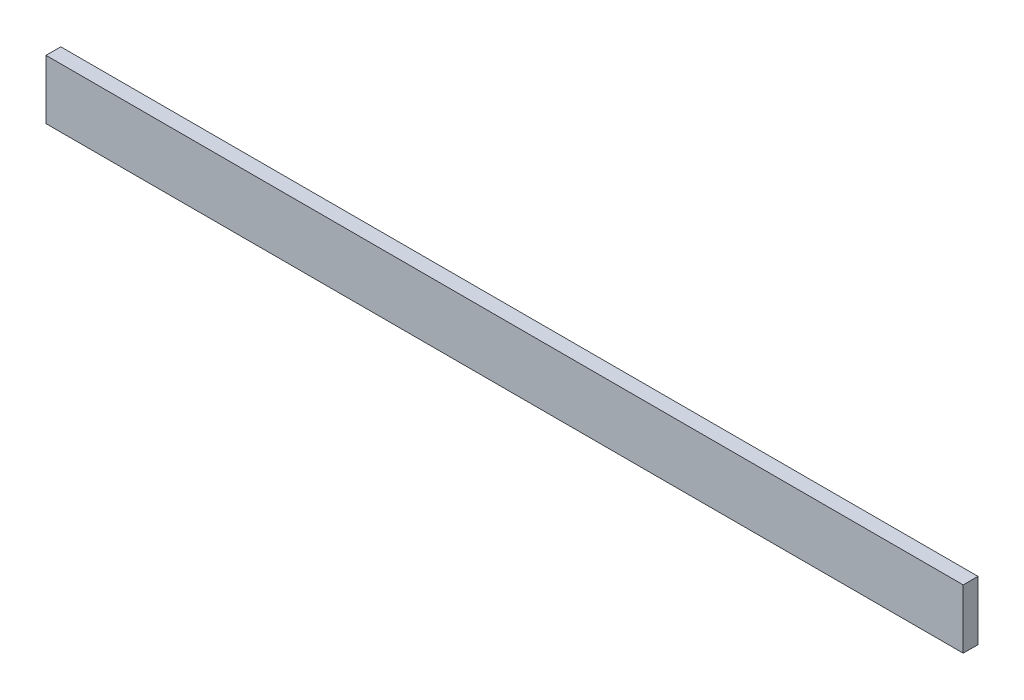
ISO-10303-21;
HEADER;
FILE_DESCRIPTION(('STEP AP214'),'2;1');
FILE_NAME('part.step','',(''),(''),'','','');
FILE_SCHEMA(('AUTOMOTIVE_DESIGN { 1 0 10303 214 1 1 1 1 }'));
ENDSEC;
DATA;
#1=APPLICATION_CONTEXT('core data for automotive mechanical design processes');
#2=APPLICATION_PROTOCOL_DEFINITION('international standard','automotive_design',2000,#1);
#3=PRODUCT_CONTEXT('',#1,'mechanical');
#4=PRODUCT('Part','Part','',(#3));
#5=PRODUCT_RELATED_PRODUCT_CATEGORY('part','',(#4));
#6=PRODUCT_DEFINITION_FORMATION('','',#4);
#7=PRODUCT_DEFINITION_CONTEXT('part definition',#1,'design');
#8=PRODUCT_DEFINITION('design','',#6,#7);
#9=PRODUCT_DEFINITION_SHAPE('','',#8);
#10=(LENGTH_UNIT() NAMED_UNIT(*) SI_UNIT(.MILLI.,.METRE.));
#11=(NAMED_UNIT(*) PLANE_ANGLE_UNIT() SI_UNIT($,.RADIAN.));
#12=(NAMED_UNIT(*) SI_UNIT($,.STERADIAN.) SOLID_ANGLE_UNIT());
#13=UNCERTAINTY_MEASURE_WITH_UNIT(LENGTH_MEASURE(1.E-05),#10,'distance_accuracy_value','');
#14=(GEOMETRIC_REPRESENTATION_CONTEXT(3) GLOBAL_UNCERTAINTY_ASSIGNED_CONTEXT((#13)) GLOBAL_UNIT_ASSIGNED_CONTEXT((#10,
#11,#12)) REPRESENTATION_CONTEXT('',''));
#15=CARTESIAN_POINT('',(0.,0.,0.));
#16=DIRECTION('',(0.,0.,1.));
#17=DIRECTION('',(1.,0.,0.));
#18=AXIS2_PLACEMENT_3D('',#15,#16,#17);
#19=CARTESIAN_POINT('',(0.,0.,5.));
#20=DIRECTION('',(1.,0.,0.));
#21=DIRECTION('',(0.,0.,-1.));
#22=AXIS2_PLACEMENT_3D('',#19,#20,#21);
#23=PLANE('',#22);
#24=DIRECTION('',(0.,-1.,0.));
#25=VECTOR('',#24,1.);
#26=CARTESIAN_POINT('',(0.,0.,0.));
#27=LINE('',#26,#25);
#28=CARTESIAN_POINT('',(0.,20.,0.));
#29=VERTEX_POINT('',#28);
#30=CARTESIAN_POINT('',(0.,0.,0.));
#31=VERTEX_POINT('',#30);
#32=EDGE_CURVE('E107',#29,#31,#27,.T.);
#33=ORIENTED_EDGE('',*,*,#32,.T.);
#34=DIRECTION('',(0.,0.,-1.));
#35=VECTOR('',#34,1.);
#36=CARTESIAN_POINT('',(0.,0.,5.));
#37=LINE('',#36,#35);
#38=CARTESIAN_POINT('',(0.,0.,5.));
#39=VERTEX_POINT('',#38);
#40=EDGE_CURVE('E11',#39,#31,#37,.T.);
#41=ORIENTED_EDGE('',*,*,#40,.F.);
#42=DIRECTION('',(0.,-1.,0.));
#43=VECTOR('',#42,1.);
#44=CARTESIAN_POINT('',(0.,0.,5.));
#45=LINE('',#44,#43);
#46=CARTESIAN_POINT('',(0.,20.,5.));
#47=VERTEX_POINT('',#46);
#48=EDGE_CURVE('E91',#47,#39,#45,.T.);
#49=ORIENTED_EDGE('',*,*,#48,.F.);
#50=DIRECTION('',(0.,0.,-1.));
#51=VECTOR('',#50,1.);
#52=CARTESIAN_POINT('',(0.,20.,5.));
#53=LINE('',#52,#51);
#54=EDGE_CURVE('E103',#47,#29,#53,.T.);
#55=ORIENTED_EDGE('',*,*,#54,.T.);
#56=EDGE_LOOP('',(#33,#41,#49,#55));
#57=FACE_BOUND('',#56,.T.);
#58=ADVANCED_FACE('F39',(#57),#23,.F.);
#59=CARTESIAN_POINT('',(0.,0.,5.));
#60=DIRECTION('',(0.,1.,0.));
#61=DIRECTION('',(0.,0.,1.));
#62=AXIS2_PLACEMENT_3D('',#59,#60,#61);
#63=PLANE('',#62);
#64=DIRECTION('',(1.,0.,0.));
#65=VECTOR('',#64,1.);
#66=CARTESIAN_POINT('',(0.,0.,0.));
#67=LINE('',#66,#65);
#68=CARTESIAN_POINT('',(310.,0.,0.));
#69=VERTEX_POINT('',#68);
#70=EDGE_CURVE('E96',#31,#69,#67,.T.);
#71=ORIENTED_EDGE('',*,*,#70,.T.);
#72=DIRECTION('',(0.,0.,-1.));
#73=VECTOR('',#72,1.);
#74=CARTESIAN_POINT('',(310.,0.,5.));
#75=LINE('',#74,#73);
#76=CARTESIAN_POINT('',(310.,0.,5.));
#77=VERTEX_POINT('',#76);
#78=EDGE_CURVE('E48',#77,#69,#75,.T.);
#79=ORIENTED_EDGE('',*,*,#78,.F.);
#80=DIRECTION('',(1.,0.,0.));
#81=VECTOR('',#80,1.);
#82=CARTESIAN_POINT('',(0.,0.,5.));
#83=LINE('',#82,#81);
#84=EDGE_CURVE('E86',#39,#77,#83,.T.);
#85=ORIENTED_EDGE('',*,*,#84,.F.);
#86=ORIENTED_EDGE('',*,*,#40,.T.);
#87=EDGE_LOOP('',(#71,#79,#85,#86));
#88=FACE_BOUND('',#87,.T.);
#89=ADVANCED_FACE('F95',(#88),#63,.F.);
#90=CARTESIAN_POINT('',(310.,0.,5.));
#91=DIRECTION('',(-1.,0.,0.));
#92=DIRECTION('',(0.,0.,1.));
#93=AXIS2_PLACEMENT_3D('',#90,#91,#92);
#94=PLANE('',#93);
#95=DIRECTION('',(0.,1.,0.));
#96=VECTOR('',#95,1.);
#97=CARTESIAN_POINT('',(310.,0.,0.));
#98=LINE('',#97,#96);
#99=CARTESIAN_POINT('',(310.,20.,0.));
#100=VERTEX_POINT('',#99);
#101=EDGE_CURVE('E73',#69,#100,#98,.T.);
#102=ORIENTED_EDGE('',*,*,#101,.T.);
#103=DIRECTION('',(0.,0.,-1.));
#104=VECTOR('',#103,1.);
#105=CARTESIAN_POINT('',(310.,20.,5.));
#106=LINE('',#105,#104);
#107=CARTESIAN_POINT('',(310.,20.,5.));
#108=VERTEX_POINT('',#107);
#109=EDGE_CURVE('E98',#108,#100,#106,.T.);
#110=ORIENTED_EDGE('',*,*,#109,.F.);
#111=DIRECTION('',(0.,1.,0.));
#112=VECTOR('',#111,1.);
#113=CARTESIAN_POINT('',(310.,0.,5.));
#114=LINE('',#113,#112);
#115=EDGE_CURVE('E89',#77,#108,#114,.T.);
#116=ORIENTED_EDGE('',*,*,#115,.F.);
#117=ORIENTED_EDGE('',*,*,#78,.T.);
#118=EDGE_LOOP('',(#102,#110,#116,#117));
#119=FACE_BOUND('',#118,.T.);
#120=ADVANCED_FACE('F99',(#119),#94,.F.);
#121=CARTESIAN_POINT('',(0.,20.,5.));
#122=DIRECTION('',(0.,-1.,0.));
#123=DIRECTION('',(0.,0.,-1.));
#124=AXIS2_PLACEMENT_3D('',#121,#122,#123);
#125=PLANE('',#124);
#126=DIRECTION('',(-1.,0.,0.));
#127=VECTOR('',#126,1.);
#128=CARTESIAN_POINT('',(0.,20.,0.));
#129=LINE('',#128,#127);
#130=EDGE_CURVE('E79',#100,#29,#129,.T.);
#131=ORIENTED_EDGE('',*,*,#130,.T.);
#132=ORIENTED_EDGE('',*,*,#54,.F.);
#133=DIRECTION('',(-1.,0.,0.));
#134=VECTOR('',#133,1.);
#135=CARTESIAN_POINT('',(0.,20.,5.));
#136=LINE('',#135,#134);
#137=EDGE_CURVE('E56',#108,#47,#136,.T.);
#138=ORIENTED_EDGE('',*,*,#137,.F.);
#139=ORIENTED_EDGE('',*,*,#109,.T.);
#140=EDGE_LOOP('',(#131,#132,#138,#139));
#141=FACE_BOUND('',#140,.T.);
#142=ADVANCED_FACE('F120',(#141),#125,.F.);
#143=CARTESIAN_POINT('',(0.,0.,5.));
#144=DIRECTION('',(0.,0.,-1.));
#145=DIRECTION('',(-1.,0.,0.));
#146=AXIS2_PLACEMENT_3D('',#143,#144,#145);
#147=PLANE('',#146);
#148=ORIENTED_EDGE('',*,*,#48,.T.);
#149=ORIENTED_EDGE('',*,*,#84,.T.);
#150=ORIENTED_EDGE('',*,*,#115,.T.);
#151=ORIENTED_EDGE('',*,*,#137,.T.);
#152=EDGE_LOOP('',(#148,#149,#150,#151));
#153=FACE_BOUND('',#152,.T.);
#154=ADVANCED_FACE('F87',(#153),#147,.F.);
#155=CARTESIAN_POINT('',(0.,0.,0.));
#156=DIRECTION('',(0.,0.,-1.));
#157=DIRECTION('',(-1.,0.,0.));
#158=AXIS2_PLACEMENT_3D('',#155,#156,#157);
#159=PLANE('',#158);
#160=ORIENTED_EDGE('',*,*,#32,.F.);
#161=ORIENTED_EDGE('',*,*,#130,.F.);
#162=ORIENTED_EDGE('',*,*,#101,.F.);
#163=ORIENTED_EDGE('',*,*,#70,.F.);
#164=EDGE_LOOP('',(#160,#161,#162,#163));
#165=FACE_BOUND('',#164,.T.);
#166=ADVANCED_FACE('F123',(#165),#159,.T.);
#167=CLOSED_SHELL('',(#58,#89,#120,#142,#154,#166));
#168=MANIFOLD_SOLID_BREP('B2',#167);
#169=ADVANCED_BREP_SHAPE_REPRESENTATION('',(#18,#168),#14);
#170=SHAPE_DEFINITION_REPRESENTATION(#9,#169);
ENDSEC;
END-ISO-10303-21;
